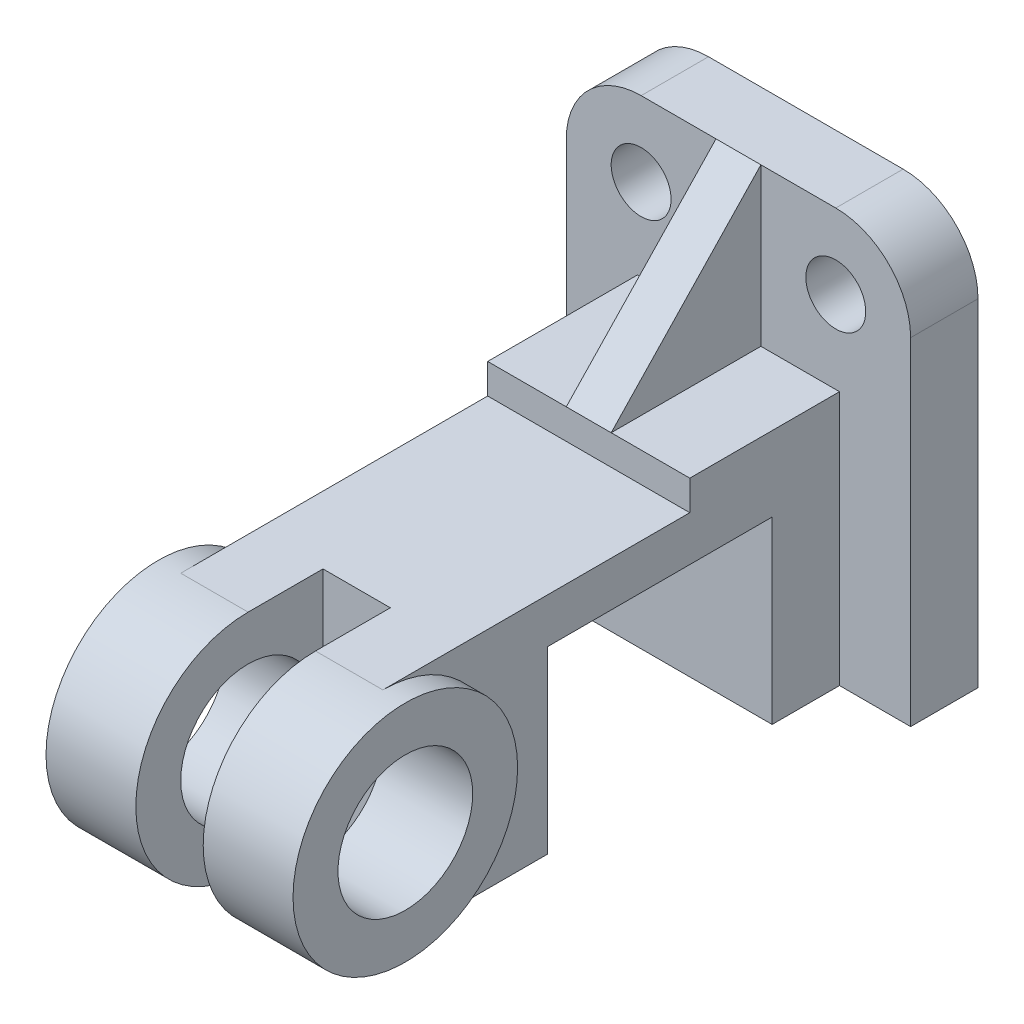
ISO-10303-21;
HEADER;
FILE_DESCRIPTION(('STEP AP214'),'2;1');
FILE_NAME('part.step','',(''),(''),'','','');
FILE_SCHEMA(('AUTOMOTIVE_DESIGN { 1 0 10303 214 1 1 1 1 }'));
ENDSEC;
DATA;
#1=APPLICATION_CONTEXT('core data for automotive mechanical design processes');
#2=APPLICATION_PROTOCOL_DEFINITION('international standard','automotive_design',2000,#1);
#3=PRODUCT_CONTEXT('',#1,'mechanical');
#4=PRODUCT('Part','Part','',(#3));
#5=PRODUCT_RELATED_PRODUCT_CATEGORY('part','',(#4));
#6=PRODUCT_DEFINITION_FORMATION('','',#4);
#7=PRODUCT_DEFINITION_CONTEXT('part definition',#1,'design');
#8=PRODUCT_DEFINITION('design','',#6,#7);
#9=PRODUCT_DEFINITION_SHAPE('','',#8);
#10=(LENGTH_UNIT() NAMED_UNIT(*) SI_UNIT(.MILLI.,.METRE.));
#11=(NAMED_UNIT(*) PLANE_ANGLE_UNIT() SI_UNIT($,.RADIAN.));
#12=(NAMED_UNIT(*) SI_UNIT($,.STERADIAN.) SOLID_ANGLE_UNIT());
#13=UNCERTAINTY_MEASURE_WITH_UNIT(LENGTH_MEASURE(1.E-05),#10,'distance_accuracy_value','');
#14=(GEOMETRIC_REPRESENTATION_CONTEXT(3) GLOBAL_UNCERTAINTY_ASSIGNED_CONTEXT((#13)) GLOBAL_UNIT_ASSIGNED_CONTEXT((#10,
#11,#12)) REPRESENTATION_CONTEXT('',''));
#15=CARTESIAN_POINT('',(0.,0.,0.));
#16=DIRECTION('',(0.,0.,1.));
#17=DIRECTION('',(1.,0.,0.));
#18=AXIS2_PLACEMENT_3D('',#15,#16,#17);
#19=CARTESIAN_POINT('',(46.,0.,0.));
#20=DIRECTION('',(0.,0.,-1.));
#21=DIRECTION('',(-1.,0.,0.));
#22=AXIS2_PLACEMENT_3D('',#19,#20,#21);
#23=PLANE('',#22);
#24=CARTESIAN_POINT('',(-26.,90.,0.));
#25=DIRECTION('',(0.,0.,1.));
#26=DIRECTION('',(1.,0.,0.));
#27=AXIS2_PLACEMENT_3D('',#24,#25,#26);
#28=CIRCLE('',#27,8.00000000000001);
#29=CARTESIAN_POINT('',(-18.,90.,0.));
#30=VERTEX_POINT('',#29);
#31=EDGE_CURVE('E494',#30,#30,#28,.T.);
#32=ORIENTED_EDGE('',*,*,#31,.F.);
#33=EDGE_LOOP('',(#32));
#34=FACE_BOUND('',#33,.T.);
#35=DIRECTION('',(0.,-1.,0.));
#36=VECTOR('',#35,1.);
#37=CARTESIAN_POINT('',(-6.,0.,0.));
#38=LINE('',#37,#36);
#39=CARTESIAN_POINT('',(-6.,110.,0.));
#40=VERTEX_POINT('',#39);
#41=CARTESIAN_POINT('',(-6.,68.,0.));
#42=VERTEX_POINT('',#41);
#43=EDGE_CURVE('E227',#40,#42,#38,.T.);
#44=ORIENTED_EDGE('',*,*,#43,.F.);
#45=DIRECTION('',(-1.,0.,0.));
#46=VECTOR('',#45,1.);
#47=CARTESIAN_POINT('',(46.,110.,0.));
#48=LINE('',#47,#46);
#49=CARTESIAN_POINT('',(-26.,110.,0.));
#50=VERTEX_POINT('',#49);
#51=EDGE_CURVE('E235',#40,#50,#48,.T.);
#52=ORIENTED_EDGE('',*,*,#51,.T.);
#53=CARTESIAN_POINT('',(-26.,90.,0.));
#54=DIRECTION('',(0.,0.,-1.));
#55=DIRECTION('',(-1.,0.,0.));
#56=AXIS2_PLACEMENT_3D('',#53,#54,#55);
#57=CIRCLE('',#56,20.);
#58=CARTESIAN_POINT('',(-46.,90.,0.));
#59=VERTEX_POINT('',#58);
#60=EDGE_CURVE('E297',#50,#59,#57,.F.);
#61=ORIENTED_EDGE('',*,*,#60,.T.);
#62=DIRECTION('',(0.,-1.,0.));
#63=VECTOR('',#62,1.);
#64=CARTESIAN_POINT('',(-46.,0.,0.));
#65=LINE('',#64,#63);
#66=CARTESIAN_POINT('',(-46.,0.,0.));
#67=VERTEX_POINT('',#66);
#68=EDGE_CURVE('E339',#59,#67,#65,.T.);
#69=ORIENTED_EDGE('',*,*,#68,.T.);
#70=DIRECTION('',(-1.,0.,0.));
#71=VECTOR('',#70,1.);
#72=CARTESIAN_POINT('',(46.,0.,0.));
#73=LINE('',#72,#71);
#74=CARTESIAN_POINT('',(-27.,0.,0.));
#75=VERTEX_POINT('',#74);
#76=EDGE_CURVE('E264',#75,#67,#73,.T.);
#77=ORIENTED_EDGE('',*,*,#76,.F.);
#78=DIRECTION('',(0.,1.,0.));
#79=VECTOR('',#78,1.);
#80=CARTESIAN_POINT('',(-27.,68.,0.));
#81=LINE('',#80,#79);
#82=CARTESIAN_POINT('',(-27.,68.,0.));
#83=VERTEX_POINT('',#82);
#84=EDGE_CURVE('E284',#75,#83,#81,.T.);
#85=ORIENTED_EDGE('',*,*,#84,.T.);
#86=DIRECTION('',(-1.,0.,0.));
#87=VECTOR('',#86,1.);
#88=CARTESIAN_POINT('',(27.,68.,0.));
#89=LINE('',#88,#87);
#90=EDGE_CURVE('E238',#42,#83,#89,.T.);
#91=ORIENTED_EDGE('',*,*,#90,.F.);
#92=EDGE_LOOP('',(#44,#52,#61,#69,#77,#85,#91));
#93=FACE_BOUND('',#92,.T.);
#94=ADVANCED_FACE('F45',(#34,#93),#23,.F.);
#95=CARTESIAN_POINT('',(27.,68.,40.));
#96=DIRECTION('',(0.,-1.,0.));
#97=DIRECTION('',(0.,0.,-1.));
#98=AXIS2_PLACEMENT_3D('',#95,#96,#97);
#99=PLANE('',#98);
#100=DIRECTION('',(0.,0.,1.));
#101=VECTOR('',#100,1.);
#102=CARTESIAN_POINT('',(-6.,68.,40.));
#103=LINE('',#102,#101);
#104=CARTESIAN_POINT('',(-6.,68.,40.));
#105=VERTEX_POINT('',#104);
#106=EDGE_CURVE('E229',#42,#105,#103,.T.);
#107=ORIENTED_EDGE('',*,*,#106,.F.);
#108=ORIENTED_EDGE('',*,*,#90,.T.);
#109=DIRECTION('',(0.,0.,1.));
#110=VECTOR('',#109,1.);
#111=CARTESIAN_POINT('',(-27.,68.,40.));
#112=LINE('',#111,#110);
#113=CARTESIAN_POINT('',(-27.,68.,40.));
#114=VERTEX_POINT('',#113);
#115=EDGE_CURVE('E404',#83,#114,#112,.T.);
#116=ORIENTED_EDGE('',*,*,#115,.T.);
#117=DIRECTION('',(-1.,0.,0.));
#118=VECTOR('',#117,1.);
#119=CARTESIAN_POINT('',(27.,68.,40.));
#120=LINE('',#119,#118);
#121=EDGE_CURVE('E360',#105,#114,#120,.T.);
#122=ORIENTED_EDGE('',*,*,#121,.F.);
#123=EDGE_LOOP('',(#107,#108,#116,#122));
#124=FACE_BOUND('',#123,.T.);
#125=ADVANCED_FACE('F566',(#124),#99,.F.);
#126=CARTESIAN_POINT('',(27.,30.,122.));
#127=DIRECTION('',(-1.,0.,0.));
#128=DIRECTION('',(0.,0.,1.));
#129=AXIS2_PLACEMENT_3D('',#126,#127,#128);
#130=CYLINDRICAL_SURFACE('',#129,30.);
#131=CARTESIAN_POINT('',(-8.99999999999999,30.,122.));
#132=DIRECTION('',(-1.,0.,0.));
#133=DIRECTION('',(0.,0.,1.));
#134=AXIS2_PLACEMENT_3D('',#131,#132,#133);
#135=CIRCLE('',#134,30.);
#136=CARTESIAN_POINT('',(-8.99999999999998,30.,152.));
#137=VERTEX_POINT('',#136);
#138=CARTESIAN_POINT('',(-8.99999999999998,0.,122.));
#139=VERTEX_POINT('',#138);
#140=EDGE_CURVE('E11',#137,#139,#135,.F.);
#141=ORIENTED_EDGE('',*,*,#140,.F.);
#142=DIRECTION('',(-1.,0.,0.));
#143=VECTOR('',#142,1.);
#144=CARTESIAN_POINT('',(27.,30.,152.));
#145=LINE('',#144,#143);
#146=CARTESIAN_POINT('',(-27.,30.,152.));
#147=VERTEX_POINT('',#146);
#148=EDGE_CURVE('E285',#137,#147,#145,.T.);
#149=ORIENTED_EDGE('',*,*,#148,.T.);
#150=ORIENTED_EDGE('',*,*,#148,.F.);
#151=CARTESIAN_POINT('',(-8.99999999999998,60.,122.));
#152=VERTEX_POINT('',#151);
#153=EDGE_CURVE('E55',#152,#137,#135,.F.);
#154=ORIENTED_EDGE('',*,*,#153,.F.);
#155=DIRECTION('',(-1.,0.,0.));
#156=VECTOR('',#155,1.);
#157=CARTESIAN_POINT('',(27.,60.,122.));
#158=LINE('',#157,#156);
#159=CARTESIAN_POINT('',(-27.,60.,122.));
#160=VERTEX_POINT('',#159);
#161=EDGE_CURVE('E275',#160,#152,#158,.F.);
#162=ORIENTED_EDGE('',*,*,#161,.F.);
#163=CARTESIAN_POINT('',(-27.,30.,122.));
#164=DIRECTION('',(-1.,0.,0.));
#165=DIRECTION('',(0.,0.,1.));
#166=AXIS2_PLACEMENT_3D('',#163,#164,#165);
#167=CIRCLE('',#166,30.);
#168=CARTESIAN_POINT('',(-27.,0.,122.));
#169=VERTEX_POINT('',#168);
#170=EDGE_CURVE('E279',#160,#169,#167,.T.);
#171=ORIENTED_EDGE('',*,*,#170,.T.);
#172=DIRECTION('',(-1.,0.,0.));
#173=VECTOR('',#172,1.);
#174=CARTESIAN_POINT('',(27.,0.,122.));
#175=LINE('',#174,#173);
#176=EDGE_CURVE('E269',#139,#169,#175,.T.);
#177=ORIENTED_EDGE('',*,*,#176,.F.);
#178=EDGE_LOOP('',(#141,#149,#150,#154,#162,#171,#177));
#179=FACE_BOUND('',#178,.T.);
#180=CARTESIAN_POINT('',(-33.,30.,122.));
#181=DIRECTION('',(1.,0.,0.));
#182=DIRECTION('',(0.,0.,-1.));
#183=AXIS2_PLACEMENT_3D('',#180,#181,#182);
#184=CIRCLE('',#183,30.);
#185=CARTESIAN_POINT('',(-33.,30.,92.));
#186=VERTEX_POINT('',#185);
#187=EDGE_CURVE('E442',#186,#186,#184,.T.);
#188=ORIENTED_EDGE('',*,*,#187,.T.);
#189=EDGE_LOOP('',(#188));
#190=FACE_BOUND('',#189,.T.);
#191=ADVANCED_FACE('F573',(#179,#190),#130,.T.);
#192=CARTESIAN_POINT('',(26.,90.,0.));
#193=DIRECTION('',(0.,0.,1.));
#194=DIRECTION('',(1.,0.,0.));
#195=AXIS2_PLACEMENT_3D('',#192,#193,#194);
#196=CIRCLE('',#195,8.00000000000002);
#197=CARTESIAN_POINT('',(34.,90.,0.));
#198=VERTEX_POINT('',#197);
#199=EDGE_CURVE('E221',#198,#198,#196,.T.);
#200=ORIENTED_EDGE('',*,*,#199,.F.);
#201=EDGE_LOOP('',(#200));
#202=FACE_BOUND('',#201,.T.);
#203=CARTESIAN_POINT('',(26.,110.,0.));
#204=VERTEX_POINT('',#203);
#205=CARTESIAN_POINT('',(6.,110.,0.));
#206=VERTEX_POINT('',#205);
#207=EDGE_CURVE('E246',#204,#206,#48,.T.);
#208=ORIENTED_EDGE('',*,*,#207,.T.);
#209=DIRECTION('',(0.,-1.,0.));
#210=VECTOR('',#209,1.);
#211=CARTESIAN_POINT('',(6.,0.,0.));
#212=LINE('',#211,#210);
#213=CARTESIAN_POINT('',(6.,68.,0.));
#214=VERTEX_POINT('',#213);
#215=EDGE_CURVE('E511',#206,#214,#212,.T.);
#216=ORIENTED_EDGE('',*,*,#215,.T.);
#217=CARTESIAN_POINT('',(27.,68.,0.));
#218=VERTEX_POINT('',#217);
#219=EDGE_CURVE('E346',#218,#214,#89,.T.);
#220=ORIENTED_EDGE('',*,*,#219,.F.);
#221=DIRECTION('',(0.,1.,0.));
#222=VECTOR('',#221,1.);
#223=CARTESIAN_POINT('',(27.,68.,0.));
#224=LINE('',#223,#222);
#225=CARTESIAN_POINT('',(27.,0.,0.));
#226=VERTEX_POINT('',#225);
#227=EDGE_CURVE('E380',#226,#218,#224,.T.);
#228=ORIENTED_EDGE('',*,*,#227,.F.);
#229=CARTESIAN_POINT('',(46.,0.,0.));
#230=VERTEX_POINT('',#229);
#231=EDGE_CURVE('E265',#230,#226,#73,.T.);
#232=ORIENTED_EDGE('',*,*,#231,.F.);
#233=DIRECTION('',(0.,-1.,0.));
#234=VECTOR('',#233,1.);
#235=CARTESIAN_POINT('',(46.,0.,0.));
#236=LINE('',#235,#234);
#237=CARTESIAN_POINT('',(46.,90.,0.));
#238=VERTEX_POINT('',#237);
#239=EDGE_CURVE('E345',#238,#230,#236,.T.);
#240=ORIENTED_EDGE('',*,*,#239,.F.);
#241=CARTESIAN_POINT('',(26.,90.,0.));
#242=DIRECTION('',(0.,0.,-1.));
#243=DIRECTION('',(-1.,0.,0.));
#244=AXIS2_PLACEMENT_3D('',#241,#242,#243);
#245=CIRCLE('',#244,20.);
#246=EDGE_CURVE('E294',#238,#204,#245,.F.);
#247=ORIENTED_EDGE('',*,*,#246,.T.);
#248=EDGE_LOOP('',(#208,#216,#220,#228,#232,#240,#247));
#249=FACE_BOUND('',#248,.T.);
#250=ADVANCED_FACE('F536',(#202,#249),#23,.F.);
#251=CARTESIAN_POINT('',(46.,0.,0.));
#252=DIRECTION('',(0.,1.,0.));
#253=DIRECTION('',(0.,0.,1.));
#254=AXIS2_PLACEMENT_3D('',#251,#252,#253);
#255=PLANE('',#254);
#256=DIRECTION('',(-1.,0.,0.));
#257=VECTOR('',#256,1.);
#258=CARTESIAN_POINT('',(27.,0.,18.));
#259=LINE('',#258,#257);
#260=CARTESIAN_POINT('',(27.,0.,18.));
#261=VERTEX_POINT('',#260);
#262=CARTESIAN_POINT('',(-27.,0.,18.));
#263=VERTEX_POINT('',#262);
#264=EDGE_CURVE('E374',#261,#263,#259,.T.);
#265=ORIENTED_EDGE('',*,*,#264,.T.);
#266=DIRECTION('',(0.,0.,-1.));
#267=VECTOR('',#266,1.);
#268=CARTESIAN_POINT('',(-27.,0.,0.));
#269=LINE('',#268,#267);
#270=EDGE_CURVE('E334',#263,#75,#269,.T.);
#271=ORIENTED_EDGE('',*,*,#270,.T.);
#272=ORIENTED_EDGE('',*,*,#76,.T.);
#273=DIRECTION('',(0.,0.,-1.));
#274=VECTOR('',#273,1.);
#275=CARTESIAN_POINT('',(-46.,0.,0.));
#276=LINE('',#275,#274);
#277=CARTESIAN_POINT('',(-46.,0.,-18.));
#278=VERTEX_POINT('',#277);
#279=EDGE_CURVE('E331',#67,#278,#276,.T.);
#280=ORIENTED_EDGE('',*,*,#279,.T.);
#281=DIRECTION('',(-1.,0.,0.));
#282=VECTOR('',#281,1.);
#283=CARTESIAN_POINT('',(46.,0.,-18.));
#284=LINE('',#283,#282);
#285=CARTESIAN_POINT('',(46.,0.,-18.));
#286=VERTEX_POINT('',#285);
#287=EDGE_CURVE('E261',#286,#278,#284,.T.);
#288=ORIENTED_EDGE('',*,*,#287,.F.);
#289=DIRECTION('',(0.,0.,-1.));
#290=VECTOR('',#289,1.);
#291=CARTESIAN_POINT('',(46.,0.,0.));
#292=LINE('',#291,#290);
#293=EDGE_CURVE('E253',#230,#286,#292,.T.);
#294=ORIENTED_EDGE('',*,*,#293,.F.);
#295=ORIENTED_EDGE('',*,*,#231,.T.);
#296=DIRECTION('',(0.,0.,-1.));
#297=VECTOR('',#296,1.);
#298=CARTESIAN_POINT('',(27.,0.,0.));
#299=LINE('',#298,#297);
#300=EDGE_CURVE('E377',#261,#226,#299,.T.);
#301=ORIENTED_EDGE('',*,*,#300,.F.);
#302=EDGE_LOOP('',(#265,#271,#272,#280,#288,#294,#295,#301));
#303=FACE_BOUND('',#302,.T.);
#304=ADVANCED_FACE('F329',(#303),#255,.F.);
#305=CARTESIAN_POINT('',(46.,0.,-18.));
#306=DIRECTION('',(0.,0.,1.));
#307=DIRECTION('',(1.,0.,0.));
#308=AXIS2_PLACEMENT_3D('',#305,#306,#307);
#309=PLANE('',#308);
#310=CARTESIAN_POINT('',(26.,90.,-18.));
#311=DIRECTION('',(0.,0.,1.));
#312=DIRECTION('',(1.,0.,0.));
#313=AXIS2_PLACEMENT_3D('',#310,#311,#312);
#314=CIRCLE('',#313,8.00000000000001);
#315=CARTESIAN_POINT('',(34.,90.,-18.));
#316=VERTEX_POINT('',#315);
#317=EDGE_CURVE('E498',#316,#316,#314,.T.);
#318=ORIENTED_EDGE('',*,*,#317,.T.);
#319=EDGE_LOOP('',(#318));
#320=FACE_BOUND('',#319,.T.);
#321=ORIENTED_EDGE('',*,*,#287,.T.);
#322=DIRECTION('',(0.,1.,0.));
#323=VECTOR('',#322,1.);
#324=CARTESIAN_POINT('',(-46.,0.,-18.));
#325=LINE('',#324,#323);
#326=CARTESIAN_POINT('',(-46.,90.,-18.));
#327=VERTEX_POINT('',#326);
#328=EDGE_CURVE('E257',#278,#327,#325,.T.);
#329=ORIENTED_EDGE('',*,*,#328,.T.);
#330=CARTESIAN_POINT('',(-26.,90.,-18.));
#331=DIRECTION('',(0.,0.,1.));
#332=DIRECTION('',(1.,0.,0.));
#333=AXIS2_PLACEMENT_3D('',#330,#331,#332);
#334=CIRCLE('',#333,20.);
#335=CARTESIAN_POINT('',(-26.,110.,-18.));
#336=VERTEX_POINT('',#335);
#337=EDGE_CURVE('E306',#327,#336,#334,.F.);
#338=ORIENTED_EDGE('',*,*,#337,.T.);
#339=DIRECTION('',(-1.,0.,0.));
#340=VECTOR('',#339,1.);
#341=CARTESIAN_POINT('',(46.,110.,-18.));
#342=LINE('',#341,#340);
#343=CARTESIAN_POINT('',(26.,110.,-18.));
#344=VERTEX_POINT('',#343);
#345=EDGE_CURVE('E251',#344,#336,#342,.T.);
#346=ORIENTED_EDGE('',*,*,#345,.F.);
#347=CARTESIAN_POINT('',(26.,90.,-18.));
#348=DIRECTION('',(0.,0.,1.));
#349=DIRECTION('',(1.,0.,0.));
#350=AXIS2_PLACEMENT_3D('',#347,#348,#349);
#351=CIRCLE('',#350,20.);
#352=CARTESIAN_POINT('',(46.,90.,-18.));
#353=VERTEX_POINT('',#352);
#354=EDGE_CURVE('E303',#344,#353,#351,.F.);
#355=ORIENTED_EDGE('',*,*,#354,.T.);
#356=DIRECTION('',(0.,1.,0.));
#357=VECTOR('',#356,1.);
#358=CARTESIAN_POINT('',(46.,0.,-18.));
#359=LINE('',#358,#357);
#360=EDGE_CURVE('E247',#286,#353,#359,.T.);
#361=ORIENTED_EDGE('',*,*,#360,.F.);
#362=EDGE_LOOP('',(#321,#329,#338,#346,#355,#361));
#363=FACE_BOUND('',#362,.T.);
#364=CARTESIAN_POINT('',(-26.,90.,-18.));
#365=DIRECTION('',(0.,0.,1.));
#366=DIRECTION('',(1.,0.,0.));
#367=AXIS2_PLACEMENT_3D('',#364,#365,#366);
#368=CIRCLE('',#367,8.00000000000001);
#369=CARTESIAN_POINT('',(-18.,90.,-18.));
#370=VERTEX_POINT('',#369);
#371=EDGE_CURVE('E490',#370,#370,#368,.T.);
#372=ORIENTED_EDGE('',*,*,#371,.T.);
#373=EDGE_LOOP('',(#372));
#374=FACE_BOUND('',#373,.T.);
#375=ADVANCED_FACE('F548',(#320,#363,#374),#309,.F.);
#376=CARTESIAN_POINT('',(46.,110.,0.));
#377=DIRECTION('',(0.,-1.,0.));
#378=DIRECTION('',(0.,0.,-1.));
#379=AXIS2_PLACEMENT_3D('',#376,#377,#378);
#380=PLANE('',#379);
#381=ORIENTED_EDGE('',*,*,#345,.T.);
#382=DIRECTION('',(0.,0.,1.));
#383=VECTOR('',#382,1.);
#384=CARTESIAN_POINT('',(-26.,110.,0.));
#385=LINE('',#384,#383);
#386=EDGE_CURVE('E244',#336,#50,#385,.T.);
#387=ORIENTED_EDGE('',*,*,#386,.T.);
#388=ORIENTED_EDGE('',*,*,#51,.F.);
#389=DIRECTION('',(-1.,0.,0.));
#390=VECTOR('',#389,1.);
#391=CARTESIAN_POINT('',(46.,110.,0.));
#392=LINE('',#391,#390);
#393=EDGE_CURVE('E212',#206,#40,#392,.T.);
#394=ORIENTED_EDGE('',*,*,#393,.F.);
#395=ORIENTED_EDGE('',*,*,#207,.F.);
#396=DIRECTION('',(0.,0.,1.));
#397=VECTOR('',#396,1.);
#398=CARTESIAN_POINT('',(26.,110.,0.));
#399=LINE('',#398,#397);
#400=EDGE_CURVE('E289',#204,#344,#399,.F.);
#401=ORIENTED_EDGE('',*,*,#400,.T.);
#402=EDGE_LOOP('',(#381,#387,#388,#394,#395,#401));
#403=FACE_BOUND('',#402,.T.);
#404=ADVANCED_FACE('F242',(#403),#380,.F.);
#405=CARTESIAN_POINT('',(46.,0.,0.));
#406=DIRECTION('',(-1.,0.,0.));
#407=DIRECTION('',(0.,0.,1.));
#408=AXIS2_PLACEMENT_3D('',#405,#406,#407);
#409=PLANE('',#408);
#410=ORIENTED_EDGE('',*,*,#360,.T.);
#411=DIRECTION('',(0.,0.,1.));
#412=VECTOR('',#411,1.);
#413=CARTESIAN_POINT('',(46.,90.,0.));
#414=LINE('',#413,#412);
#415=EDGE_CURVE('E310',#353,#238,#414,.T.);
#416=ORIENTED_EDGE('',*,*,#415,.T.);
#417=ORIENTED_EDGE('',*,*,#239,.T.);
#418=ORIENTED_EDGE('',*,*,#293,.T.);
#419=EDGE_LOOP('',(#410,#416,#417,#418));
#420=FACE_BOUND('',#419,.T.);
#421=ADVANCED_FACE('F541',(#420),#409,.F.);
#422=CARTESIAN_POINT('',(-46.,0.,0.));
#423=DIRECTION('',(-1.,0.,0.));
#424=DIRECTION('',(0.,0.,1.));
#425=AXIS2_PLACEMENT_3D('',#422,#423,#424);
#426=PLANE('',#425);
#427=ORIENTED_EDGE('',*,*,#68,.F.);
#428=DIRECTION('',(0.,0.,1.));
#429=VECTOR('',#428,1.);
#430=CARTESIAN_POINT('',(-46.,90.,-18.));
#431=LINE('',#430,#429);
#432=EDGE_CURVE('E300',#59,#327,#431,.F.);
#433=ORIENTED_EDGE('',*,*,#432,.T.);
#434=ORIENTED_EDGE('',*,*,#328,.F.);
#435=ORIENTED_EDGE('',*,*,#279,.F.);
#436=EDGE_LOOP('',(#427,#433,#434,#435));
#437=FACE_BOUND('',#436,.T.);
#438=ADVANCED_FACE('F338',(#437),#426,.T.);
#439=ORIENTED_EDGE('',*,*,#219,.T.);
#440=DIRECTION('',(0.,0.,1.));
#441=VECTOR('',#440,1.);
#442=CARTESIAN_POINT('',(6.,68.,40.));
#443=LINE('',#442,#441);
#444=CARTESIAN_POINT('',(6.,68.,40.));
#445=VERTEX_POINT('',#444);
#446=EDGE_CURVE('E507',#214,#445,#443,.T.);
#447=ORIENTED_EDGE('',*,*,#446,.T.);
#448=CARTESIAN_POINT('',(27.,68.,40.));
#449=VERTEX_POINT('',#448);
#450=EDGE_CURVE('E356',#449,#445,#120,.T.);
#451=ORIENTED_EDGE('',*,*,#450,.F.);
#452=DIRECTION('',(0.,0.,1.));
#453=VECTOR('',#452,1.);
#454=CARTESIAN_POINT('',(27.,68.,40.));
#455=LINE('',#454,#453);
#456=EDGE_CURVE('E432',#218,#449,#455,.T.);
#457=ORIENTED_EDGE('',*,*,#456,.F.);
#458=EDGE_LOOP('',(#439,#447,#451,#457));
#459=FACE_BOUND('',#458,.T.);
#460=ADVANCED_FACE('F522',(#459),#99,.F.);
#461=CARTESIAN_POINT('',(27.,60.,40.));
#462=DIRECTION('',(0.,0.,-1.));
#463=DIRECTION('',(-1.,0.,0.));
#464=AXIS2_PLACEMENT_3D('',#461,#462,#463);
#465=PLANE('',#464);
#466=ORIENTED_EDGE('',*,*,#450,.T.);
#467=DIRECTION('',(1.,0.,0.));
#468=VECTOR('',#467,1.);
#469=CARTESIAN_POINT('',(27.,68.,40.));
#470=LINE('',#469,#468);
#471=EDGE_CURVE('E222',#105,#445,#470,.T.);
#472=ORIENTED_EDGE('',*,*,#471,.F.);
#473=ORIENTED_EDGE('',*,*,#121,.T.);
#474=DIRECTION('',(0.,-1.,0.));
#475=VECTOR('',#474,1.);
#476=CARTESIAN_POINT('',(-27.,60.,40.));
#477=LINE('',#476,#475);
#478=CARTESIAN_POINT('',(-27.,60.,40.));
#479=VERTEX_POINT('',#478);
#480=EDGE_CURVE('E400',#114,#479,#477,.T.);
#481=ORIENTED_EDGE('',*,*,#480,.T.);
#482=DIRECTION('',(-1.,0.,0.));
#483=VECTOR('',#482,1.);
#484=CARTESIAN_POINT('',(27.,60.,40.));
#485=LINE('',#484,#483);
#486=CARTESIAN_POINT('',(27.,60.,40.));
#487=VERTEX_POINT('',#486);
#488=EDGE_CURVE('E361',#487,#479,#485,.T.);
#489=ORIENTED_EDGE('',*,*,#488,.F.);
#490=DIRECTION('',(0.,-1.,0.));
#491=VECTOR('',#490,1.);
#492=CARTESIAN_POINT('',(27.,60.,40.));
#493=LINE('',#492,#491);
#494=EDGE_CURVE('E429',#449,#487,#493,.T.);
#495=ORIENTED_EDGE('',*,*,#494,.F.);
#496=EDGE_LOOP('',(#466,#472,#473,#481,#489,#495));
#497=FACE_BOUND('',#496,.T.);
#498=ADVANCED_FACE('F527',(#497),#465,.F.);
#499=CARTESIAN_POINT('',(27.,60.,152.));
#500=DIRECTION('',(0.,-1.,0.));
#501=DIRECTION('',(0.,0.,-1.));
#502=AXIS2_PLACEMENT_3D('',#499,#500,#501);
#503=PLANE('',#502);
#504=ORIENTED_EDGE('',*,*,#488,.T.);
#505=DIRECTION('',(0.,0.,1.));
#506=VECTOR('',#505,1.);
#507=CARTESIAN_POINT('',(-27.,60.,152.));
#508=LINE('',#507,#506);
#509=EDGE_CURVE('E396',#479,#160,#508,.T.);
#510=ORIENTED_EDGE('',*,*,#509,.T.);
#511=ORIENTED_EDGE('',*,*,#161,.T.);
#512=DIRECTION('',(0.,0.,1.));
#513=VECTOR('',#512,1.);
#514=CARTESIAN_POINT('',(-8.99999999999999,60.,102.));
#515=LINE('',#514,#513);
#516=CARTESIAN_POINT('',(-8.99999999999999,60.,102.));
#517=VERTEX_POINT('',#516);
#518=EDGE_CURVE('E466',#517,#152,#515,.T.);
#519=ORIENTED_EDGE('',*,*,#518,.F.);
#520=DIRECTION('',(-1.,0.,0.));
#521=VECTOR('',#520,1.);
#522=CARTESIAN_POINT('',(-8.99999999999999,60.,102.));
#523=LINE('',#522,#521);
#524=CARTESIAN_POINT('',(9.00000000000001,60.,102.));
#525=VERTEX_POINT('',#524);
#526=EDGE_CURVE('E458',#525,#517,#523,.T.);
#527=ORIENTED_EDGE('',*,*,#526,.F.);
#528=DIRECTION('',(0.,0.,-1.));
#529=VECTOR('',#528,1.);
#530=CARTESIAN_POINT('',(9.00000000000001,60.,102.));
#531=LINE('',#530,#529);
#532=CARTESIAN_POINT('',(9.00000000000001,60.,122.));
#533=VERTEX_POINT('',#532);
#534=EDGE_CURVE('E463',#533,#525,#531,.T.);
#535=ORIENTED_EDGE('',*,*,#534,.F.);
#536=CARTESIAN_POINT('',(27.,60.,122.));
#537=VERTEX_POINT('',#536);
#538=EDGE_CURVE('E274',#533,#537,#158,.F.);
#539=ORIENTED_EDGE('',*,*,#538,.T.);
#540=DIRECTION('',(0.,0.,1.));
#541=VECTOR('',#540,1.);
#542=CARTESIAN_POINT('',(27.,60.,152.));
#543=LINE('',#542,#541);
#544=EDGE_CURVE('E425',#487,#537,#543,.T.);
#545=ORIENTED_EDGE('',*,*,#544,.F.);
#546=EDGE_LOOP('',(#504,#510,#511,#519,#527,#535,#539,#545));
#547=FACE_BOUND('',#546,.T.);
#548=ADVANCED_FACE('F642',(#547),#503,.F.);
#549=CARTESIAN_POINT('',(27.,0.,78.));
#550=DIRECTION('',(0.,1.,0.));
#551=DIRECTION('',(0.,0.,1.));
#552=AXIS2_PLACEMENT_3D('',#549,#550,#551);
#553=PLANE('',#552);
#554=DIRECTION('',(-1.,0.,0.));
#555=VECTOR('',#554,1.);
#556=CARTESIAN_POINT('',(-8.99999999999999,0.,102.));
#557=LINE('',#556,#555);
#558=CARTESIAN_POINT('',(9.00000000000001,0.,102.));
#559=VERTEX_POINT('',#558);
#560=CARTESIAN_POINT('',(-8.99999999999999,0.,102.));
#561=VERTEX_POINT('',#560);
#562=EDGE_CURVE('E455',#559,#561,#557,.T.);
#563=ORIENTED_EDGE('',*,*,#562,.T.);
#564=DIRECTION('',(0.,0.,1.));
#565=VECTOR('',#564,1.);
#566=CARTESIAN_POINT('',(-8.99999999999999,0.,102.));
#567=LINE('',#566,#565);
#568=EDGE_CURVE('E462',#561,#139,#567,.T.);
#569=ORIENTED_EDGE('',*,*,#568,.T.);
#570=ORIENTED_EDGE('',*,*,#176,.T.);
#571=DIRECTION('',(0.,0.,-1.));
#572=VECTOR('',#571,1.);
#573=CARTESIAN_POINT('',(-27.,0.,78.));
#574=LINE('',#573,#572);
#575=CARTESIAN_POINT('',(-27.,0.,78.));
#576=VERTEX_POINT('',#575);
#577=EDGE_CURVE('E392',#169,#576,#574,.T.);
#578=ORIENTED_EDGE('',*,*,#577,.T.);
#579=DIRECTION('',(-1.,0.,0.));
#580=VECTOR('',#579,1.);
#581=CARTESIAN_POINT('',(27.,0.,78.));
#582=LINE('',#581,#580);
#583=CARTESIAN_POINT('',(27.,0.,78.));
#584=VERTEX_POINT('',#583);
#585=EDGE_CURVE('E364',#584,#576,#582,.T.);
#586=ORIENTED_EDGE('',*,*,#585,.F.);
#587=DIRECTION('',(0.,0.,-1.));
#588=VECTOR('',#587,1.);
#589=CARTESIAN_POINT('',(27.,0.,78.));
#590=LINE('',#589,#588);
#591=CARTESIAN_POINT('',(27.,0.,122.));
#592=VERTEX_POINT('',#591);
#593=EDGE_CURVE('E422',#592,#584,#590,.T.);
#594=ORIENTED_EDGE('',*,*,#593,.F.);
#595=CARTESIAN_POINT('',(9.00000000000001,0.,122.));
#596=VERTEX_POINT('',#595);
#597=EDGE_CURVE('E270',#592,#596,#175,.T.);
#598=ORIENTED_EDGE('',*,*,#597,.T.);
#599=DIRECTION('',(0.,0.,-1.));
#600=VECTOR('',#599,1.);
#601=CARTESIAN_POINT('',(9.00000000000001,0.,102.));
#602=LINE('',#601,#600);
#603=EDGE_CURVE('E472',#596,#559,#602,.T.);
#604=ORIENTED_EDGE('',*,*,#603,.T.);
#605=EDGE_LOOP('',(#563,#569,#570,#578,#586,#594,#598,#604));
#606=FACE_BOUND('',#605,.T.);
#607=ADVANCED_FACE('F638',(#606),#553,.F.);
#608=CARTESIAN_POINT('',(27.,48.,78.));
#609=DIRECTION('',(0.,0.,1.));
#610=DIRECTION('',(1.,0.,0.));
#611=AXIS2_PLACEMENT_3D('',#608,#609,#610);
#612=PLANE('',#611);
#613=ORIENTED_EDGE('',*,*,#585,.T.);
#614=DIRECTION('',(0.,1.,0.));
#615=VECTOR('',#614,1.);
#616=CARTESIAN_POINT('',(-27.,48.,78.));
#617=LINE('',#616,#615);
#618=CARTESIAN_POINT('',(-27.,48.,78.));
#619=VERTEX_POINT('',#618);
#620=EDGE_CURVE('E389',#576,#619,#617,.T.);
#621=ORIENTED_EDGE('',*,*,#620,.T.);
#622=DIRECTION('',(-1.,0.,0.));
#623=VECTOR('',#622,1.);
#624=CARTESIAN_POINT('',(27.,48.,78.));
#625=LINE('',#624,#623);
#626=CARTESIAN_POINT('',(27.,48.,78.));
#627=VERTEX_POINT('',#626);
#628=EDGE_CURVE('E367',#627,#619,#625,.T.);
#629=ORIENTED_EDGE('',*,*,#628,.F.);
#630=DIRECTION('',(0.,1.,0.));
#631=VECTOR('',#630,1.);
#632=CARTESIAN_POINT('',(27.,48.,78.));
#633=LINE('',#632,#631);
#634=EDGE_CURVE('E419',#584,#627,#633,.T.);
#635=ORIENTED_EDGE('',*,*,#634,.F.);
#636=EDGE_LOOP('',(#613,#621,#629,#635));
#637=FACE_BOUND('',#636,.T.);
#638=ADVANCED_FACE('F634',(#637),#612,.F.);
#639=CARTESIAN_POINT('',(27.,48.,18.));
#640=DIRECTION('',(0.,1.,0.));
#641=DIRECTION('',(0.,0.,1.));
#642=AXIS2_PLACEMENT_3D('',#639,#640,#641);
#643=PLANE('',#642);
#644=DIRECTION('',(0.,0.,-1.));
#645=VECTOR('',#644,1.);
#646=CARTESIAN_POINT('',(-27.,48.,18.));
#647=LINE('',#646,#645);
#648=CARTESIAN_POINT('',(-27.,48.,18.));
#649=VERTEX_POINT('',#648);
#650=EDGE_CURVE('E385',#619,#649,#647,.T.);
#651=ORIENTED_EDGE('',*,*,#650,.T.);
#652=DIRECTION('',(-1.,0.,0.));
#653=VECTOR('',#652,1.);
#654=CARTESIAN_POINT('',(27.,48.,18.));
#655=LINE('',#654,#653);
#656=CARTESIAN_POINT('',(27.,48.,18.));
#657=VERTEX_POINT('',#656);
#658=EDGE_CURVE('E371',#657,#649,#655,.T.);
#659=ORIENTED_EDGE('',*,*,#658,.F.);
#660=DIRECTION('',(0.,0.,-1.));
#661=VECTOR('',#660,1.);
#662=CARTESIAN_POINT('',(27.,48.,18.));
#663=LINE('',#662,#661);
#664=EDGE_CURVE('E416',#627,#657,#663,.T.);
#665=ORIENTED_EDGE('',*,*,#664,.F.);
#666=ORIENTED_EDGE('',*,*,#628,.T.);
#667=EDGE_LOOP('',(#651,#659,#665,#666));
#668=FACE_BOUND('',#667,.T.);
#669=ADVANCED_FACE('F630',(#668),#643,.F.);
#670=CARTESIAN_POINT('',(27.,0.,18.));
#671=DIRECTION('',(0.,0.,-1.));
#672=DIRECTION('',(0.,1.,0.));
#673=AXIS2_PLACEMENT_3D('',#670,#671,#672);
#674=PLANE('',#673);
#675=ORIENTED_EDGE('',*,*,#658,.T.);
#676=DIRECTION('',(0.,-1.,0.));
#677=VECTOR('',#676,1.);
#678=CARTESIAN_POINT('',(-27.,0.,18.));
#679=LINE('',#678,#677);
#680=EDGE_CURVE('E381',#649,#263,#679,.T.);
#681=ORIENTED_EDGE('',*,*,#680,.T.);
#682=ORIENTED_EDGE('',*,*,#264,.F.);
#683=DIRECTION('',(0.,-1.,0.));
#684=VECTOR('',#683,1.);
#685=CARTESIAN_POINT('',(27.,0.,18.));
#686=LINE('',#685,#684);
#687=EDGE_CURVE('E413',#657,#261,#686,.T.);
#688=ORIENTED_EDGE('',*,*,#687,.F.);
#689=EDGE_LOOP('',(#675,#681,#682,#688));
#690=FACE_BOUND('',#689,.T.);
#691=ADVANCED_FACE('F624',(#690),#674,.F.);
#692=CARTESIAN_POINT('',(27.,0.,0.));
#693=DIRECTION('',(-1.,0.,0.));
#694=DIRECTION('',(0.,0.,1.));
#695=AXIS2_PLACEMENT_3D('',#692,#693,#694);
#696=PLANE('',#695);
#697=ORIENTED_EDGE('',*,*,#544,.T.);
#698=CARTESIAN_POINT('',(27.,30.,122.));
#699=DIRECTION('',(-1.,0.,0.));
#700=DIRECTION('',(0.,0.,1.));
#701=AXIS2_PLACEMENT_3D('',#698,#699,#700);
#702=CIRCLE('',#701,30.);
#703=EDGE_CURVE('E438',#537,#592,#702,.T.);
#704=ORIENTED_EDGE('',*,*,#703,.T.);
#705=ORIENTED_EDGE('',*,*,#593,.T.);
#706=ORIENTED_EDGE('',*,*,#634,.T.);
#707=ORIENTED_EDGE('',*,*,#664,.T.);
#708=ORIENTED_EDGE('',*,*,#687,.T.);
#709=ORIENTED_EDGE('',*,*,#300,.T.);
#710=ORIENTED_EDGE('',*,*,#227,.T.);
#711=ORIENTED_EDGE('',*,*,#456,.T.);
#712=ORIENTED_EDGE('',*,*,#494,.T.);
#713=EDGE_LOOP('',(#697,#704,#705,#706,#707,#708,#709,#710,#711,#712));
#714=FACE_BOUND('',#713,.T.);
#715=ADVANCED_FACE('F531',(#714),#696,.F.);
#716=CARTESIAN_POINT('',(-27.,0.,0.));
#717=DIRECTION('',(-1.,0.,0.));
#718=DIRECTION('',(0.,0.,1.));
#719=AXIS2_PLACEMENT_3D('',#716,#717,#718);
#720=PLANE('',#719);
#721=ORIENTED_EDGE('',*,*,#170,.F.);
#722=ORIENTED_EDGE('',*,*,#509,.F.);
#723=ORIENTED_EDGE('',*,*,#480,.F.);
#724=ORIENTED_EDGE('',*,*,#115,.F.);
#725=ORIENTED_EDGE('',*,*,#84,.F.);
#726=ORIENTED_EDGE('',*,*,#270,.F.);
#727=ORIENTED_EDGE('',*,*,#680,.F.);
#728=ORIENTED_EDGE('',*,*,#650,.F.);
#729=ORIENTED_EDGE('',*,*,#620,.F.);
#730=ORIENTED_EDGE('',*,*,#577,.F.);
#731=EDGE_LOOP('',(#721,#722,#723,#724,#725,#726,#727,#728,#729,#730));
#732=FACE_BOUND('',#731,.T.);
#733=ADVANCED_FACE('F623',(#732),#720,.T.);
#734=CARTESIAN_POINT('',(9.00000000000001,30.,122.));
#735=DIRECTION('',(1.,0.,0.));
#736=DIRECTION('',(0.,0.,-1.));
#737=AXIS2_PLACEMENT_3D('',#734,#735,#736);
#738=CIRCLE('',#737,30.);
#739=CARTESIAN_POINT('',(9.00000000000002,30.,152.));
#740=VERTEX_POINT('',#739);
#741=EDGE_CURVE('E70',#596,#740,#738,.F.);
#742=ORIENTED_EDGE('',*,*,#741,.F.);
#743=ORIENTED_EDGE('',*,*,#597,.F.);
#744=ORIENTED_EDGE('',*,*,#703,.F.);
#745=ORIENTED_EDGE('',*,*,#538,.F.);
#746=EDGE_CURVE('E314',#740,#533,#738,.F.);
#747=ORIENTED_EDGE('',*,*,#746,.F.);
#748=CARTESIAN_POINT('',(27.,30.,152.));
#749=VERTEX_POINT('',#748);
#750=EDGE_CURVE('E280',#749,#740,#145,.T.);
#751=ORIENTED_EDGE('',*,*,#750,.F.);
#752=ORIENTED_EDGE('',*,*,#750,.T.);
#753=EDGE_LOOP('',(#742,#743,#744,#745,#747,#751,#752));
#754=FACE_BOUND('',#753,.T.);
#755=CARTESIAN_POINT('',(33.,30.,122.));
#756=DIRECTION('',(1.,0.,0.));
#757=DIRECTION('',(0.,0.,-1.));
#758=AXIS2_PLACEMENT_3D('',#755,#756,#757);
#759=CIRCLE('',#758,30.);
#760=CARTESIAN_POINT('',(33.,30.,92.));
#761=VERTEX_POINT('',#760);
#762=EDGE_CURVE('E446',#761,#761,#759,.T.);
#763=ORIENTED_EDGE('',*,*,#762,.F.);
#764=EDGE_LOOP('',(#763));
#765=FACE_BOUND('',#764,.T.);
#766=ADVANCED_FACE('F585',(#754,#765),#130,.T.);
#767=CARTESIAN_POINT('',(-33.,30.,122.));
#768=DIRECTION('',(1.,0.,0.));
#769=DIRECTION('',(0.,0.,-1.));
#770=AXIS2_PLACEMENT_3D('',#767,#768,#769);
#771=PLANE('',#770);
#772=CARTESIAN_POINT('',(-33.,30.,122.));
#773=DIRECTION('',(1.,0.,0.));
#774=DIRECTION('',(0.,0.,-1.));
#775=AXIS2_PLACEMENT_3D('',#772,#773,#774);
#776=CIRCLE('',#775,18.);
#777=CARTESIAN_POINT('',(-33.,30.,104.));
#778=VERTEX_POINT('',#777);
#779=EDGE_CURVE('E469',#778,#778,#776,.T.);
#780=ORIENTED_EDGE('',*,*,#779,.T.);
#781=EDGE_LOOP('',(#780));
#782=FACE_BOUND('',#781,.T.);
#783=ORIENTED_EDGE('',*,*,#187,.F.);
#784=EDGE_LOOP('',(#783));
#785=FACE_BOUND('',#784,.T.);
#786=ADVANCED_FACE('F561',(#782,#785),#771,.F.);
#787=CARTESIAN_POINT('',(33.,30.,122.));
#788=DIRECTION('',(1.,0.,0.));
#789=DIRECTION('',(0.,0.,-1.));
#790=AXIS2_PLACEMENT_3D('',#787,#788,#789);
#791=PLANE('',#790);
#792=CARTESIAN_POINT('',(33.,30.,122.));
#793=DIRECTION('',(1.,0.,0.));
#794=DIRECTION('',(0.,0.,-1.));
#795=AXIS2_PLACEMENT_3D('',#792,#793,#794);
#796=CIRCLE('',#795,18.);
#797=CARTESIAN_POINT('',(33.,30.,104.));
#798=VERTEX_POINT('',#797);
#799=EDGE_CURVE('E486',#798,#798,#796,.T.);
#800=ORIENTED_EDGE('',*,*,#799,.F.);
#801=EDGE_LOOP('',(#800));
#802=FACE_BOUND('',#801,.T.);
#803=ORIENTED_EDGE('',*,*,#762,.T.);
#804=EDGE_LOOP('',(#803));
#805=FACE_BOUND('',#804,.T.);
#806=ADVANCED_FACE('F554',(#802,#805),#791,.T.);
#807=CARTESIAN_POINT('',(-26.,90.,0.));
#808=DIRECTION('',(0.,0.,-1.));
#809=DIRECTION('',(-1.,0.,0.));
#810=AXIS2_PLACEMENT_3D('',#807,#808,#809);
#811=CYLINDRICAL_SURFACE('',#810,20.);
#812=ORIENTED_EDGE('',*,*,#337,.F.);
#813=ORIENTED_EDGE('',*,*,#432,.F.);
#814=ORIENTED_EDGE('',*,*,#60,.F.);
#815=ORIENTED_EDGE('',*,*,#386,.F.);
#816=EDGE_LOOP('',(#812,#813,#814,#815));
#817=FACE_BOUND('',#816,.T.);
#818=ADVANCED_FACE('F552',(#817),#811,.T.);
#819=CARTESIAN_POINT('',(26.,90.,0.));
#820=DIRECTION('',(0.,0.,1.));
#821=DIRECTION('',(1.,0.,0.));
#822=AXIS2_PLACEMENT_3D('',#819,#820,#821);
#823=CYLINDRICAL_SURFACE('',#822,20.);
#824=ORIENTED_EDGE('',*,*,#354,.F.);
#825=ORIENTED_EDGE('',*,*,#400,.F.);
#826=ORIENTED_EDGE('',*,*,#246,.F.);
#827=ORIENTED_EDGE('',*,*,#415,.F.);
#828=EDGE_LOOP('',(#824,#825,#826,#827));
#829=FACE_BOUND('',#828,.T.);
#830=ADVANCED_FACE('F47',(#829),#823,.T.);
#831=CARTESIAN_POINT('',(-8.99999999999999,0.,102.));
#832=DIRECTION('',(-1.,0.,0.));
#833=DIRECTION('',(0.,0.,1.));
#834=AXIS2_PLACEMENT_3D('',#831,#832,#833);
#835=PLANE('',#834);
#836=CARTESIAN_POINT('',(-8.99999999999999,30.,122.));
#837=DIRECTION('',(-1.,0.,0.));
#838=DIRECTION('',(0.,0.,1.));
#839=AXIS2_PLACEMENT_3D('',#836,#837,#838);
#840=CIRCLE('',#839,18.);
#841=CARTESIAN_POINT('',(-8.99999999999999,30.,140.));
#842=VERTEX_POINT('',#841);
#843=EDGE_CURVE('E482',#842,#842,#840,.T.);
#844=ORIENTED_EDGE('',*,*,#843,.T.);
#845=EDGE_LOOP('',(#844));
#846=FACE_BOUND('',#845,.T.);
#847=ORIENTED_EDGE('',*,*,#140,.T.);
#848=ORIENTED_EDGE('',*,*,#568,.F.);
#849=DIRECTION('',(0.,1.,0.));
#850=VECTOR('',#849,1.);
#851=CARTESIAN_POINT('',(-8.99999999999999,0.,102.));
#852=LINE('',#851,#850);
#853=EDGE_CURVE('E450',#561,#517,#852,.T.);
#854=ORIENTED_EDGE('',*,*,#853,.T.);
#855=ORIENTED_EDGE('',*,*,#518,.T.);
#856=ORIENTED_EDGE('',*,*,#153,.T.);
#857=EDGE_LOOP('',(#847,#848,#854,#855,#856));
#858=FACE_BOUND('',#857,.T.);
#859=ADVANCED_FACE('F559',(#846,#858),#835,.F.);
#860=CARTESIAN_POINT('',(-8.99999999999999,0.,102.));
#861=DIRECTION('',(0.,0.,-1.));
#862=DIRECTION('',(0.,1.,0.));
#863=AXIS2_PLACEMENT_3D('',#860,#861,#862);
#864=PLANE('',#863);
#865=ORIENTED_EDGE('',*,*,#853,.F.);
#866=ORIENTED_EDGE('',*,*,#562,.F.);
#867=DIRECTION('',(0.,1.,0.));
#868=VECTOR('',#867,1.);
#869=CARTESIAN_POINT('',(9.00000000000001,0.,102.));
#870=LINE('',#869,#868);
#871=EDGE_CURVE('E451',#559,#525,#870,.T.);
#872=ORIENTED_EDGE('',*,*,#871,.T.);
#873=ORIENTED_EDGE('',*,*,#526,.T.);
#874=EDGE_LOOP('',(#865,#866,#872,#873));
#875=FACE_BOUND('',#874,.T.);
#876=ADVANCED_FACE('F607',(#875),#864,.F.);
#877=CARTESIAN_POINT('',(9.00000000000001,0.,102.));
#878=DIRECTION('',(1.,0.,0.));
#879=DIRECTION('',(0.,0.,-1.));
#880=AXIS2_PLACEMENT_3D('',#877,#878,#879);
#881=PLANE('',#880);
#882=CARTESIAN_POINT('',(9.00000000000001,30.,122.));
#883=DIRECTION('',(1.,0.,0.));
#884=DIRECTION('',(0.,0.,-1.));
#885=AXIS2_PLACEMENT_3D('',#882,#883,#884);
#886=CIRCLE('',#885,18.);
#887=CARTESIAN_POINT('',(9.00000000000001,30.,104.));
#888=VERTEX_POINT('',#887);
#889=EDGE_CURVE('E49',#888,#888,#886,.T.);
#890=ORIENTED_EDGE('',*,*,#889,.T.);
#891=EDGE_LOOP('',(#890));
#892=FACE_BOUND('',#891,.T.);
#893=ORIENTED_EDGE('',*,*,#741,.T.);
#894=ORIENTED_EDGE('',*,*,#746,.T.);
#895=ORIENTED_EDGE('',*,*,#534,.T.);
#896=ORIENTED_EDGE('',*,*,#871,.F.);
#897=ORIENTED_EDGE('',*,*,#603,.F.);
#898=EDGE_LOOP('',(#893,#894,#895,#896,#897));
#899=FACE_BOUND('',#898,.T.);
#900=ADVANCED_FACE('F610',(#892,#899),#881,.F.);
#901=CARTESIAN_POINT('',(33.,30.,122.));
#902=DIRECTION('',(1.,0.,0.));
#903=DIRECTION('',(0.,0.,-1.));
#904=AXIS2_PLACEMENT_3D('',#901,#902,#903);
#905=CYLINDRICAL_SURFACE('',#904,18.);
#906=ORIENTED_EDGE('',*,*,#799,.T.);
#907=EDGE_LOOP('',(#906));
#908=FACE_BOUND('',#907,.T.);
#909=ORIENTED_EDGE('',*,*,#889,.F.);
#910=EDGE_LOOP('',(#909));
#911=FACE_BOUND('',#910,.T.);
#912=ADVANCED_FACE('F605',(#908,#911),#905,.F.);
#913=ORIENTED_EDGE('',*,*,#843,.F.);
#914=EDGE_LOOP('',(#913));
#915=FACE_BOUND('',#914,.T.);
#916=ORIENTED_EDGE('',*,*,#779,.F.);
#917=EDGE_LOOP('',(#916));
#918=FACE_BOUND('',#917,.T.);
#919=ADVANCED_FACE('F597',(#915,#918),#905,.F.);
#920=CARTESIAN_POINT('',(-26.,90.,0.));
#921=DIRECTION('',(0.,0.,1.));
#922=DIRECTION('',(1.,0.,0.));
#923=AXIS2_PLACEMENT_3D('',#920,#921,#922);
#924=CYLINDRICAL_SURFACE('',#923,8.00000000000001);
#925=ORIENTED_EDGE('',*,*,#371,.F.);
#926=EDGE_LOOP('',(#925));
#927=FACE_BOUND('',#926,.T.);
#928=ORIENTED_EDGE('',*,*,#31,.T.);
#929=EDGE_LOOP('',(#928));
#930=FACE_BOUND('',#929,.T.);
#931=ADVANCED_FACE('F589',(#927,#930),#924,.F.);
#932=CARTESIAN_POINT('',(26.,90.,0.));
#933=DIRECTION('',(0.,0.,1.));
#934=DIRECTION('',(1.,0.,0.));
#935=AXIS2_PLACEMENT_3D('',#932,#933,#934);
#936=CYLINDRICAL_SURFACE('',#935,8.00000000000001);
#937=ORIENTED_EDGE('',*,*,#317,.F.);
#938=EDGE_LOOP('',(#937));
#939=FACE_BOUND('',#938,.T.);
#940=ORIENTED_EDGE('',*,*,#199,.T.);
#941=EDGE_LOOP('',(#940));
#942=FACE_BOUND('',#941,.T.);
#943=ADVANCED_FACE('F588',(#939,#942),#936,.F.);
#944=CARTESIAN_POINT('',(0.,110.,0.));
#945=DIRECTION('',(0.,0.689655172413793,0.724137931034483));
#946=DIRECTION('',(0.,-0.724137931034483,0.689655172413793));
#947=AXIS2_PLACEMENT_3D('',#944,#945,#946);
#948=PLANE('',#947);
#949=DIRECTION('',(0.,-0.724137931034483,0.689655172413793));
#950=VECTOR('',#949,1.);
#951=CARTESIAN_POINT('',(6.,110.,0.));
#952=LINE('',#951,#950);
#953=EDGE_CURVE('E215',#206,#445,#952,.T.);
#954=ORIENTED_EDGE('',*,*,#953,.F.);
#955=ORIENTED_EDGE('',*,*,#393,.T.);
#956=DIRECTION('',(0.,-0.724137931034483,0.689655172413793));
#957=VECTOR('',#956,1.);
#958=CARTESIAN_POINT('',(-6.,110.,0.));
#959=LINE('',#958,#957);
#960=EDGE_CURVE('E62',#40,#105,#959,.T.);
#961=ORIENTED_EDGE('',*,*,#960,.T.);
#962=ORIENTED_EDGE('',*,*,#471,.T.);
#963=EDGE_LOOP('',(#954,#955,#961,#962));
#964=FACE_BOUND('',#963,.T.);
#965=ADVANCED_FACE('F213',(#964),#948,.T.);
#966=CARTESIAN_POINT('',(6.,55.,67.));
#967=DIRECTION('',(1.,0.,0.));
#968=DIRECTION('',(0.,0.,-1.));
#969=AXIS2_PLACEMENT_3D('',#966,#967,#968);
#970=PLANE('',#969);
#971=ORIENTED_EDGE('',*,*,#446,.F.);
#972=ORIENTED_EDGE('',*,*,#215,.F.);
#973=ORIENTED_EDGE('',*,*,#953,.T.);
#974=EDGE_LOOP('',(#971,#972,#973));
#975=FACE_BOUND('',#974,.T.);
#976=ADVANCED_FACE('F519',(#975),#970,.T.);
#977=CARTESIAN_POINT('',(-6.,55.,67.));
#978=DIRECTION('',(1.,0.,0.));
#979=DIRECTION('',(0.,0.,-1.));
#980=AXIS2_PLACEMENT_3D('',#977,#978,#979);
#981=PLANE('',#980);
#982=ORIENTED_EDGE('',*,*,#43,.T.);
#983=ORIENTED_EDGE('',*,*,#106,.T.);
#984=ORIENTED_EDGE('',*,*,#960,.F.);
#985=EDGE_LOOP('',(#982,#983,#984));
#986=FACE_BOUND('',#985,.T.);
#987=ADVANCED_FACE('F226',(#986),#981,.F.);
#988=CLOSED_SHELL('',(#94,#125,#191,#250,#304,#375,#404,#421,#438,#460,#498,#548,#607,#638,#669,
#691,#715,#733,#766,#786,#806,#818,#830,#859,#876,#900,#912,#919,#931,#943,#965,#976,#987));
#989=MANIFOLD_SOLID_BREP('B2',#988);
#990=ADVANCED_BREP_SHAPE_REPRESENTATION('',(#18,#989),#14);
#991=SHAPE_DEFINITION_REPRESENTATION(#9,#990);
ENDSEC;
END-ISO-10303-21;
